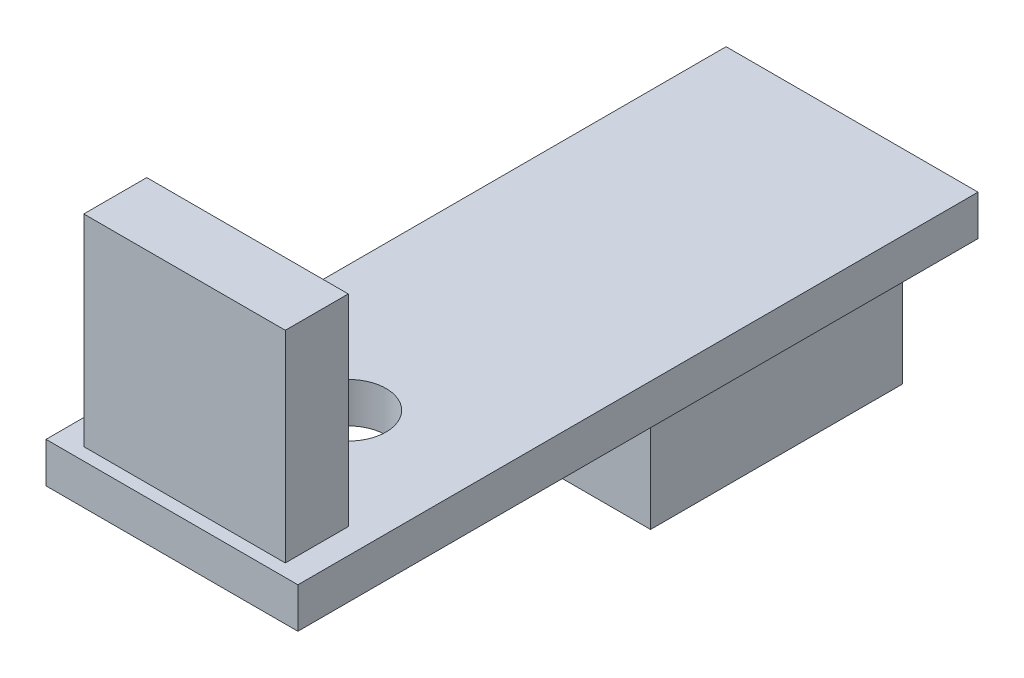
ISO-10303-21;
HEADER;
FILE_DESCRIPTION(('STEP AP214'),'2;1');
FILE_NAME('part.step','',(''),(''),'','','');
FILE_SCHEMA(('AUTOMOTIVE_DESIGN { 1 0 10303 214 1 1 1 1 }'));
ENDSEC;
DATA;
#1=APPLICATION_CONTEXT('core data for automotive mechanical design processes');
#2=APPLICATION_PROTOCOL_DEFINITION('international standard','automotive_design',2000,#1);
#3=PRODUCT_CONTEXT('',#1,'mechanical');
#4=PRODUCT('Part','Part','',(#3));
#5=PRODUCT_RELATED_PRODUCT_CATEGORY('part','',(#4));
#6=PRODUCT_DEFINITION_FORMATION('','',#4);
#7=PRODUCT_DEFINITION_CONTEXT('part definition',#1,'design');
#8=PRODUCT_DEFINITION('design','',#6,#7);
#9=PRODUCT_DEFINITION_SHAPE('','',#8);
#10=(LENGTH_UNIT() NAMED_UNIT(*) SI_UNIT(.MILLI.,.METRE.));
#11=(NAMED_UNIT(*) PLANE_ANGLE_UNIT() SI_UNIT($,.RADIAN.));
#12=(NAMED_UNIT(*) SI_UNIT($,.STERADIAN.) SOLID_ANGLE_UNIT());
#13=UNCERTAINTY_MEASURE_WITH_UNIT(LENGTH_MEASURE(1.E-05),#10,'distance_accuracy_value','');
#14=(GEOMETRIC_REPRESENTATION_CONTEXT(3) GLOBAL_UNCERTAINTY_ASSIGNED_CONTEXT((#13)) GLOBAL_UNIT_ASSIGNED_CONTEXT((#10,
#11,#12)) REPRESENTATION_CONTEXT('',''));
#15=CARTESIAN_POINT('',(0.,0.,0.));
#16=DIRECTION('',(0.,0.,1.));
#17=DIRECTION('',(1.,0.,0.));
#18=AXIS2_PLACEMENT_3D('',#15,#16,#17);
#19=CARTESIAN_POINT('',(0.,0.,0.));
#20=DIRECTION('',(0.,1.,0.));
#21=DIRECTION('',(0.,0.,1.));
#22=AXIS2_PLACEMENT_3D('',#19,#20,#21);
#23=PLANE('',#22);
#24=CARTESIAN_POINT('',(0.,0.,0.));
#25=DIRECTION('',(0.,1.,0.));
#26=DIRECTION('',(0.,0.,1.));
#27=AXIS2_PLACEMENT_3D('',#24,#25,#26);
#28=CIRCLE('',#27,1.5);
#29=CARTESIAN_POINT('',(0.,0.,1.5));
#30=VERTEX_POINT('',#29);
#31=EDGE_CURVE('E200',#30,#30,#28,.T.);
#32=ORIENTED_EDGE('',*,*,#31,.T.);
#33=EDGE_LOOP('',(#32));
#34=FACE_BOUND('',#33,.T.);
#35=DIRECTION('',(0.,0.,1.));
#36=VECTOR('',#35,1.);
#37=CARTESIAN_POINT('',(-5.,0.,-20.));
#38=LINE('',#37,#36);
#39=CARTESIAN_POINT('',(-5.,0.,-20.));
#40=VERTEX_POINT('',#39);
#41=CARTESIAN_POINT('',(-5.,0.,7.));
#42=VERTEX_POINT('',#41);
#43=EDGE_CURVE('E205',#40,#42,#38,.T.);
#44=ORIENTED_EDGE('',*,*,#43,.F.);
#45=DIRECTION('',(-1.,0.,0.));
#46=VECTOR('',#45,1.);
#47=CARTESIAN_POINT('',(-5.,0.,-20.));
#48=LINE('',#47,#46);
#49=CARTESIAN_POINT('',(5.,0.,-20.));
#50=VERTEX_POINT('',#49);
#51=EDGE_CURVE('E214',#50,#40,#48,.T.);
#52=ORIENTED_EDGE('',*,*,#51,.F.);
#53=DIRECTION('',(0.,0.,-1.));
#54=VECTOR('',#53,1.);
#55=CARTESIAN_POINT('',(5.,0.,-20.));
#56=LINE('',#55,#54);
#57=CARTESIAN_POINT('',(5.,0.,7.));
#58=VERTEX_POINT('',#57);
#59=EDGE_CURVE('E230',#58,#50,#56,.T.);
#60=ORIENTED_EDGE('',*,*,#59,.F.);
#61=DIRECTION('',(1.,0.,0.));
#62=VECTOR('',#61,1.);
#63=CARTESIAN_POINT('',(-5.,0.,7.));
#64=LINE('',#63,#62);
#65=EDGE_CURVE('E227',#42,#58,#64,.T.);
#66=ORIENTED_EDGE('',*,*,#65,.F.);
#67=EDGE_LOOP('',(#44,#52,#60,#66));
#68=FACE_BOUND('',#67,.T.);
#69=DIRECTION('',(0.,0.,-1.));
#70=VECTOR('',#69,1.);
#71=CARTESIAN_POINT('',(-2.5,0.,-9.5));
#72=LINE('',#71,#70);
#73=CARTESIAN_POINT('',(-2.5,0.,-9.5));
#74=VERTEX_POINT('',#73);
#75=CARTESIAN_POINT('',(-2.5,0.,-19.5));
#76=VERTEX_POINT('',#75);
#77=EDGE_CURVE('E151',#74,#76,#72,.T.);
#78=ORIENTED_EDGE('',*,*,#77,.F.);
#79=DIRECTION('',(-1.,0.,0.));
#80=VECTOR('',#79,1.);
#81=CARTESIAN_POINT('',(-2.5,0.,-9.5));
#82=LINE('',#81,#80);
#83=CARTESIAN_POINT('',(2.5,0.,-9.5));
#84=VERTEX_POINT('',#83);
#85=EDGE_CURVE('E148',#84,#74,#82,.T.);
#86=ORIENTED_EDGE('',*,*,#85,.F.);
#87=DIRECTION('',(0.,0.,1.));
#88=VECTOR('',#87,1.);
#89=CARTESIAN_POINT('',(2.5,0.,-9.5));
#90=LINE('',#89,#88);
#91=CARTESIAN_POINT('',(2.5,0.,-19.5));
#92=VERTEX_POINT('',#91);
#93=EDGE_CURVE('E60',#92,#84,#90,.T.);
#94=ORIENTED_EDGE('',*,*,#93,.F.);
#95=DIRECTION('',(1.,0.,0.));
#96=VECTOR('',#95,1.);
#97=CARTESIAN_POINT('',(-2.5,0.,-19.5));
#98=LINE('',#97,#96);
#99=EDGE_CURVE('E55',#76,#92,#98,.T.);
#100=ORIENTED_EDGE('',*,*,#99,.F.);
#101=EDGE_LOOP('',(#78,#86,#94,#100));
#102=FACE_BOUND('',#101,.T.);
#103=ADVANCED_FACE('F39',(#34,#68,#102),#23,.F.);
#104=CARTESIAN_POINT('',(0.,1.6,0.));
#105=DIRECTION('',(0.,1.,0.));
#106=DIRECTION('',(0.,0.,1.));
#107=AXIS2_PLACEMENT_3D('',#104,#105,#106);
#108=PLANE('',#107);
#109=DIRECTION('',(0.,0.,1.));
#110=VECTOR('',#109,1.);
#111=CARTESIAN_POINT('',(-5.,1.6,-20.));
#112=LINE('',#111,#110);
#113=CARTESIAN_POINT('',(-5.,1.6,-20.));
#114=VERTEX_POINT('',#113);
#115=CARTESIAN_POINT('',(-5.,1.6,7.));
#116=VERTEX_POINT('',#115);
#117=EDGE_CURVE('E209',#114,#116,#112,.T.);
#118=ORIENTED_EDGE('',*,*,#117,.T.);
#119=DIRECTION('',(1.,0.,0.));
#120=VECTOR('',#119,1.);
#121=CARTESIAN_POINT('',(-5.,1.6,7.));
#122=LINE('',#121,#120);
#123=CARTESIAN_POINT('',(5.,1.6,7.));
#124=VERTEX_POINT('',#123);
#125=EDGE_CURVE('E213',#116,#124,#122,.T.);
#126=ORIENTED_EDGE('',*,*,#125,.T.);
#127=DIRECTION('',(0.,0.,-1.));
#128=VECTOR('',#127,1.);
#129=CARTESIAN_POINT('',(5.,1.6,-20.));
#130=LINE('',#129,#128);
#131=CARTESIAN_POINT('',(5.,1.6,-20.));
#132=VERTEX_POINT('',#131);
#133=EDGE_CURVE('E217',#124,#132,#130,.T.);
#134=ORIENTED_EDGE('',*,*,#133,.T.);
#135=DIRECTION('',(-1.,0.,0.));
#136=VECTOR('',#135,1.);
#137=CARTESIAN_POINT('',(-5.,1.6,-20.));
#138=LINE('',#137,#136);
#139=EDGE_CURVE('E220',#132,#114,#138,.T.);
#140=ORIENTED_EDGE('',*,*,#139,.T.);
#141=EDGE_LOOP('',(#118,#126,#134,#140));
#142=FACE_BOUND('',#141,.T.);
#143=CARTESIAN_POINT('',(0.,1.6,0.));
#144=DIRECTION('',(0.,1.,0.));
#145=DIRECTION('',(0.,0.,1.));
#146=AXIS2_PLACEMENT_3D('',#143,#144,#145);
#147=CIRCLE('',#146,1.5);
#148=CARTESIAN_POINT('',(0.,1.6,1.5));
#149=VERTEX_POINT('',#148);
#150=EDGE_CURVE('E201',#149,#149,#147,.T.);
#151=ORIENTED_EDGE('',*,*,#150,.F.);
#152=EDGE_LOOP('',(#151));
#153=FACE_BOUND('',#152,.T.);
#154=DIRECTION('',(1.,0.,0.));
#155=VECTOR('',#154,1.);
#156=CARTESIAN_POINT('',(-4.,1.6,6.5));
#157=LINE('',#156,#155);
#158=CARTESIAN_POINT('',(-4.,1.6,6.5));
#159=VERTEX_POINT('',#158);
#160=CARTESIAN_POINT('',(4.,1.6,6.5));
#161=VERTEX_POINT('',#160);
#162=EDGE_CURVE('E158',#159,#161,#157,.T.);
#163=ORIENTED_EDGE('',*,*,#162,.F.);
#164=DIRECTION('',(0.,0.,1.));
#165=VECTOR('',#164,1.);
#166=CARTESIAN_POINT('',(-4.,1.6,4.));
#167=LINE('',#166,#165);
#168=CARTESIAN_POINT('',(-4.,1.6,4.));
#169=VERTEX_POINT('',#168);
#170=EDGE_CURVE('E153',#169,#159,#167,.T.);
#171=ORIENTED_EDGE('',*,*,#170,.F.);
#172=DIRECTION('',(-1.,0.,0.));
#173=VECTOR('',#172,1.);
#174=CARTESIAN_POINT('',(-4.,1.6,4.));
#175=LINE('',#174,#173);
#176=CARTESIAN_POINT('',(4.,1.6,4.));
#177=VERTEX_POINT('',#176);
#178=EDGE_CURVE('E169',#177,#169,#175,.T.);
#179=ORIENTED_EDGE('',*,*,#178,.F.);
#180=DIRECTION('',(0.,0.,-1.));
#181=VECTOR('',#180,1.);
#182=CARTESIAN_POINT('',(4.,1.6,4.));
#183=LINE('',#182,#181);
#184=EDGE_CURVE('E181',#161,#177,#183,.T.);
#185=ORIENTED_EDGE('',*,*,#184,.F.);
#186=EDGE_LOOP('',(#163,#171,#179,#185));
#187=FACE_BOUND('',#186,.T.);
#188=ADVANCED_FACE('F261',(#142,#153,#187),#108,.T.);
#189=CARTESIAN_POINT('',(-5.,1.6,-20.));
#190=DIRECTION('',(1.,0.,0.));
#191=DIRECTION('',(0.,0.,-1.));
#192=AXIS2_PLACEMENT_3D('',#189,#190,#191);
#193=PLANE('',#192);
#194=ORIENTED_EDGE('',*,*,#43,.T.);
#195=DIRECTION('',(0.,-1.,0.));
#196=VECTOR('',#195,1.);
#197=CARTESIAN_POINT('',(-5.,1.6,7.));
#198=LINE('',#197,#196);
#199=EDGE_CURVE('E11',#116,#42,#198,.T.);
#200=ORIENTED_EDGE('',*,*,#199,.F.);
#201=ORIENTED_EDGE('',*,*,#117,.F.);
#202=DIRECTION('',(0.,-1.,0.));
#203=VECTOR('',#202,1.);
#204=CARTESIAN_POINT('',(-5.,1.6,-20.));
#205=LINE('',#204,#203);
#206=EDGE_CURVE('E223',#114,#40,#205,.T.);
#207=ORIENTED_EDGE('',*,*,#206,.T.);
#208=EDGE_LOOP('',(#194,#200,#201,#207));
#209=FACE_BOUND('',#208,.T.);
#210=ADVANCED_FACE('F41',(#209),#193,.F.);
#211=CARTESIAN_POINT('',(-5.,1.6,7.));
#212=DIRECTION('',(0.,0.,-1.));
#213=DIRECTION('',(-1.,0.,0.));
#214=AXIS2_PLACEMENT_3D('',#211,#212,#213);
#215=PLANE('',#214);
#216=ORIENTED_EDGE('',*,*,#65,.T.);
#217=DIRECTION('',(0.,-1.,0.));
#218=VECTOR('',#217,1.);
#219=CARTESIAN_POINT('',(5.,1.6,7.));
#220=LINE('',#219,#218);
#221=EDGE_CURVE('E48',#124,#58,#220,.T.);
#222=ORIENTED_EDGE('',*,*,#221,.F.);
#223=ORIENTED_EDGE('',*,*,#125,.F.);
#224=ORIENTED_EDGE('',*,*,#199,.T.);
#225=EDGE_LOOP('',(#216,#222,#223,#224));
#226=FACE_BOUND('',#225,.T.);
#227=ADVANCED_FACE('F263',(#226),#215,.F.);
#228=CARTESIAN_POINT('',(5.,1.6,-20.));
#229=DIRECTION('',(-1.,0.,0.));
#230=DIRECTION('',(0.,0.,1.));
#231=AXIS2_PLACEMENT_3D('',#228,#229,#230);
#232=PLANE('',#231);
#233=ORIENTED_EDGE('',*,*,#59,.T.);
#234=DIRECTION('',(0.,-1.,0.));
#235=VECTOR('',#234,1.);
#236=CARTESIAN_POINT('',(5.,1.6,-20.));
#237=LINE('',#236,#235);
#238=EDGE_CURVE('E238',#132,#50,#237,.T.);
#239=ORIENTED_EDGE('',*,*,#238,.F.);
#240=ORIENTED_EDGE('',*,*,#133,.F.);
#241=ORIENTED_EDGE('',*,*,#221,.T.);
#242=EDGE_LOOP('',(#233,#239,#240,#241));
#243=FACE_BOUND('',#242,.T.);
#244=ADVANCED_FACE('F247',(#243),#232,.F.);
#245=CARTESIAN_POINT('',(-5.,1.6,-20.));
#246=DIRECTION('',(0.,0.,1.));
#247=DIRECTION('',(1.,0.,0.));
#248=AXIS2_PLACEMENT_3D('',#245,#246,#247);
#249=PLANE('',#248);
#250=ORIENTED_EDGE('',*,*,#51,.T.);
#251=ORIENTED_EDGE('',*,*,#206,.F.);
#252=ORIENTED_EDGE('',*,*,#139,.F.);
#253=ORIENTED_EDGE('',*,*,#238,.T.);
#254=EDGE_LOOP('',(#250,#251,#252,#253));
#255=FACE_BOUND('',#254,.T.);
#256=ADVANCED_FACE('F255',(#255),#249,.F.);
#257=CARTESIAN_POINT('',(0.,1.6,0.));
#258=DIRECTION('',(0.,-1.,0.));
#259=DIRECTION('',(0.,0.,-1.));
#260=AXIS2_PLACEMENT_3D('',#257,#258,#259);
#261=CYLINDRICAL_SURFACE('',#260,1.5);
#262=ORIENTED_EDGE('',*,*,#150,.T.);
#263=EDGE_LOOP('',(#262));
#264=FACE_BOUND('',#263,.T.);
#265=ORIENTED_EDGE('',*,*,#31,.F.);
#266=EDGE_LOOP('',(#265));
#267=FACE_BOUND('',#266,.T.);
#268=ADVANCED_FACE('F280',(#264,#267),#261,.F.);
#269=CARTESIAN_POINT('',(-4.,9.6,4.));
#270=DIRECTION('',(1.,0.,0.));
#271=DIRECTION('',(0.,0.,-1.));
#272=AXIS2_PLACEMENT_3D('',#269,#270,#271);
#273=PLANE('',#272);
#274=ORIENTED_EDGE('',*,*,#170,.T.);
#275=DIRECTION('',(0.,-1.,0.));
#276=VECTOR('',#275,1.);
#277=CARTESIAN_POINT('',(-4.,9.6,6.5));
#278=LINE('',#277,#276);
#279=CARTESIAN_POINT('',(-4.,9.6,6.5));
#280=VERTEX_POINT('',#279);
#281=EDGE_CURVE('E197',#280,#159,#278,.T.);
#282=ORIENTED_EDGE('',*,*,#281,.F.);
#283=DIRECTION('',(0.,0.,1.));
#284=VECTOR('',#283,1.);
#285=CARTESIAN_POINT('',(-4.,9.6,4.));
#286=LINE('',#285,#284);
#287=CARTESIAN_POINT('',(-4.,9.6,4.));
#288=VERTEX_POINT('',#287);
#289=EDGE_CURVE('E164',#288,#280,#286,.T.);
#290=ORIENTED_EDGE('',*,*,#289,.F.);
#291=DIRECTION('',(0.,-1.,0.));
#292=VECTOR('',#291,1.);
#293=CARTESIAN_POINT('',(-4.,9.6,4.));
#294=LINE('',#293,#292);
#295=EDGE_CURVE('E177',#288,#169,#294,.T.);
#296=ORIENTED_EDGE('',*,*,#295,.T.);
#297=EDGE_LOOP('',(#274,#282,#290,#296));
#298=FACE_BOUND('',#297,.T.);
#299=ADVANCED_FACE('F284',(#298),#273,.F.);
#300=CARTESIAN_POINT('',(-4.,9.6,6.5));
#301=DIRECTION('',(0.,0.,-1.));
#302=DIRECTION('',(-1.,0.,0.));
#303=AXIS2_PLACEMENT_3D('',#300,#301,#302);
#304=PLANE('',#303);
#305=ORIENTED_EDGE('',*,*,#162,.T.);
#306=DIRECTION('',(0.,-1.,0.));
#307=VECTOR('',#306,1.);
#308=CARTESIAN_POINT('',(4.,9.6,6.5));
#309=LINE('',#308,#307);
#310=CARTESIAN_POINT('',(4.,9.6,6.5));
#311=VERTEX_POINT('',#310);
#312=EDGE_CURVE('E193',#311,#161,#309,.T.);
#313=ORIENTED_EDGE('',*,*,#312,.F.);
#314=DIRECTION('',(1.,0.,0.));
#315=VECTOR('',#314,1.);
#316=CARTESIAN_POINT('',(-4.,9.6,6.5));
#317=LINE('',#316,#315);
#318=EDGE_CURVE('E168',#280,#311,#317,.T.);
#319=ORIENTED_EDGE('',*,*,#318,.F.);
#320=ORIENTED_EDGE('',*,*,#281,.T.);
#321=EDGE_LOOP('',(#305,#313,#319,#320));
#322=FACE_BOUND('',#321,.T.);
#323=ADVANCED_FACE('F289',(#322),#304,.F.);
#324=CARTESIAN_POINT('',(4.,9.6,4.));
#325=DIRECTION('',(-1.,0.,0.));
#326=DIRECTION('',(0.,0.,1.));
#327=AXIS2_PLACEMENT_3D('',#324,#325,#326);
#328=PLANE('',#327);
#329=ORIENTED_EDGE('',*,*,#184,.T.);
#330=DIRECTION('',(0.,-1.,0.));
#331=VECTOR('',#330,1.);
#332=CARTESIAN_POINT('',(4.,9.6,4.));
#333=LINE('',#332,#331);
#334=CARTESIAN_POINT('',(4.,9.6,4.));
#335=VERTEX_POINT('',#334);
#336=EDGE_CURVE('E190',#335,#177,#333,.T.);
#337=ORIENTED_EDGE('',*,*,#336,.F.);
#338=DIRECTION('',(0.,0.,-1.));
#339=VECTOR('',#338,1.);
#340=CARTESIAN_POINT('',(4.,9.6,4.));
#341=LINE('',#340,#339);
#342=EDGE_CURVE('E172',#311,#335,#341,.T.);
#343=ORIENTED_EDGE('',*,*,#342,.F.);
#344=ORIENTED_EDGE('',*,*,#312,.T.);
#345=EDGE_LOOP('',(#329,#337,#343,#344));
#346=FACE_BOUND('',#345,.T.);
#347=ADVANCED_FACE('F296',(#346),#328,.F.);
#348=CARTESIAN_POINT('',(-4.,9.6,4.));
#349=DIRECTION('',(0.,0.,1.));
#350=DIRECTION('',(1.,0.,0.));
#351=AXIS2_PLACEMENT_3D('',#348,#349,#350);
#352=PLANE('',#351);
#353=ORIENTED_EDGE('',*,*,#178,.T.);
#354=ORIENTED_EDGE('',*,*,#295,.F.);
#355=DIRECTION('',(-1.,0.,0.));
#356=VECTOR('',#355,1.);
#357=CARTESIAN_POINT('',(-4.,9.6,4.));
#358=LINE('',#357,#356);
#359=EDGE_CURVE('E175',#335,#288,#358,.T.);
#360=ORIENTED_EDGE('',*,*,#359,.F.);
#361=ORIENTED_EDGE('',*,*,#336,.T.);
#362=EDGE_LOOP('',(#353,#354,#360,#361));
#363=FACE_BOUND('',#362,.T.);
#364=ADVANCED_FACE('F300',(#363),#352,.F.);
#365=CARTESIAN_POINT('',(0.,9.6,0.));
#366=DIRECTION('',(0.,1.,0.));
#367=DIRECTION('',(0.,0.,1.));
#368=AXIS2_PLACEMENT_3D('',#365,#366,#367);
#369=PLANE('',#368);
#370=ORIENTED_EDGE('',*,*,#289,.T.);
#371=ORIENTED_EDGE('',*,*,#318,.T.);
#372=ORIENTED_EDGE('',*,*,#342,.T.);
#373=ORIENTED_EDGE('',*,*,#359,.T.);
#374=EDGE_LOOP('',(#370,#371,#372,#373));
#375=FACE_BOUND('',#374,.T.);
#376=ADVANCED_FACE('F304',(#375),#369,.T.);
#377=CARTESIAN_POINT('',(-2.5,-6.,-9.5));
#378=DIRECTION('',(1.,0.,0.));
#379=DIRECTION('',(0.,0.,-1.));
#380=AXIS2_PLACEMENT_3D('',#377,#378,#379);
#381=PLANE('',#380);
#382=ORIENTED_EDGE('',*,*,#77,.T.);
#383=DIRECTION('',(0.,1.,0.));
#384=VECTOR('',#383,1.);
#385=CARTESIAN_POINT('',(-2.5,-6.,-19.5));
#386=LINE('',#385,#384);
#387=CARTESIAN_POINT('',(-2.5,-6.,-19.5));
#388=VERTEX_POINT('',#387);
#389=EDGE_CURVE('E130',#388,#76,#386,.T.);
#390=ORIENTED_EDGE('',*,*,#389,.F.);
#391=DIRECTION('',(0.,0.,-1.));
#392=VECTOR('',#391,1.);
#393=CARTESIAN_POINT('',(-2.5,-6.,-9.5));
#394=LINE('',#393,#392);
#395=CARTESIAN_POINT('',(-2.5,-6.,-9.5));
#396=VERTEX_POINT('',#395);
#397=EDGE_CURVE('E138',#396,#388,#394,.T.);
#398=ORIENTED_EDGE('',*,*,#397,.F.);
#399=DIRECTION('',(0.,1.,0.));
#400=VECTOR('',#399,1.);
#401=CARTESIAN_POINT('',(-2.5,-6.,-9.5));
#402=LINE('',#401,#400);
#403=EDGE_CURVE('E418',#396,#74,#402,.T.);
#404=ORIENTED_EDGE('',*,*,#403,.T.);
#405=EDGE_LOOP('',(#382,#390,#398,#404));
#406=FACE_BOUND('',#405,.T.);
#407=ADVANCED_FACE('F150',(#406),#381,.F.);
#408=CARTESIAN_POINT('',(-2.5,-6.,-19.5));
#409=DIRECTION('',(0.,0.,1.));
#410=DIRECTION('',(1.,0.,0.));
#411=AXIS2_PLACEMENT_3D('',#408,#409,#410);
#412=PLANE('',#411);
#413=ORIENTED_EDGE('',*,*,#99,.T.);
#414=DIRECTION('',(0.,1.,0.));
#415=VECTOR('',#414,1.);
#416=CARTESIAN_POINT('',(2.5,-6.,-19.5));
#417=LINE('',#416,#415);
#418=CARTESIAN_POINT('',(2.5,-6.,-19.5));
#419=VERTEX_POINT('',#418);
#420=EDGE_CURVE('E133',#419,#92,#417,.T.);
#421=ORIENTED_EDGE('',*,*,#420,.F.);
#422=DIRECTION('',(1.,0.,0.));
#423=VECTOR('',#422,1.);
#424=CARTESIAN_POINT('',(-2.5,-6.,-19.5));
#425=LINE('',#424,#423);
#426=EDGE_CURVE('E126',#388,#419,#425,.T.);
#427=ORIENTED_EDGE('',*,*,#426,.F.);
#428=ORIENTED_EDGE('',*,*,#389,.T.);
#429=EDGE_LOOP('',(#413,#421,#427,#428));
#430=FACE_BOUND('',#429,.T.);
#431=ADVANCED_FACE('F128',(#430),#412,.F.);
#432=CARTESIAN_POINT('',(2.5,-6.,-9.5));
#433=DIRECTION('',(-1.,0.,0.));
#434=DIRECTION('',(0.,0.,1.));
#435=AXIS2_PLACEMENT_3D('',#432,#433,#434);
#436=PLANE('',#435);
#437=ORIENTED_EDGE('',*,*,#93,.T.);
#438=DIRECTION('',(0.,1.,0.));
#439=VECTOR('',#438,1.);
#440=CARTESIAN_POINT('',(2.5,-6.,-9.5));
#441=LINE('',#440,#439);
#442=CARTESIAN_POINT('',(2.5,-6.,-9.5));
#443=VERTEX_POINT('',#442);
#444=EDGE_CURVE('E160',#443,#84,#441,.T.);
#445=ORIENTED_EDGE('',*,*,#444,.F.);
#446=DIRECTION('',(0.,0.,1.));
#447=VECTOR('',#446,1.);
#448=CARTESIAN_POINT('',(2.5,-6.,-9.5));
#449=LINE('',#448,#447);
#450=EDGE_CURVE('E137',#419,#443,#449,.T.);
#451=ORIENTED_EDGE('',*,*,#450,.F.);
#452=ORIENTED_EDGE('',*,*,#420,.T.);
#453=EDGE_LOOP('',(#437,#445,#451,#452));
#454=FACE_BOUND('',#453,.T.);
#455=ADVANCED_FACE('F313',(#454),#436,.F.);
#456=CARTESIAN_POINT('',(-2.5,-6.,-9.5));
#457=DIRECTION('',(0.,0.,-1.));
#458=DIRECTION('',(-1.,0.,0.));
#459=AXIS2_PLACEMENT_3D('',#456,#457,#458);
#460=PLANE('',#459);
#461=ORIENTED_EDGE('',*,*,#85,.T.);
#462=ORIENTED_EDGE('',*,*,#403,.F.);
#463=DIRECTION('',(-1.,0.,0.));
#464=VECTOR('',#463,1.);
#465=CARTESIAN_POINT('',(-2.5,-6.,-9.5));
#466=LINE('',#465,#464);
#467=EDGE_CURVE('E143',#443,#396,#466,.T.);
#468=ORIENTED_EDGE('',*,*,#467,.F.);
#469=ORIENTED_EDGE('',*,*,#444,.T.);
#470=EDGE_LOOP('',(#461,#462,#468,#469));
#471=FACE_BOUND('',#470,.T.);
#472=ADVANCED_FACE('F316',(#471),#460,.F.);
#473=CARTESIAN_POINT('',(0.,-6.,0.));
#474=DIRECTION('',(0.,-1.,0.));
#475=DIRECTION('',(0.,0.,-1.));
#476=AXIS2_PLACEMENT_3D('',#473,#474,#475);
#477=PLANE('',#476);
#478=ORIENTED_EDGE('',*,*,#397,.T.);
#479=ORIENTED_EDGE('',*,*,#426,.T.);
#480=ORIENTED_EDGE('',*,*,#450,.T.);
#481=ORIENTED_EDGE('',*,*,#467,.T.);
#482=EDGE_LOOP('',(#478,#479,#480,#481));
#483=FACE_BOUND('',#482,.T.);
#484=ADVANCED_FACE('F141',(#483),#477,.T.);
#485=CLOSED_SHELL('',(#103,#188,#210,#227,#244,#256,#268,#299,#323,#347,#364,#376,#407,#431,
#455,#472,#484));
#486=MANIFOLD_SOLID_BREP('B2',#485);
#487=ADVANCED_BREP_SHAPE_REPRESENTATION('',(#18,#486),#14);
#488=SHAPE_DEFINITION_REPRESENTATION(#9,#487);
ENDSEC;
END-ISO-10303-21;
